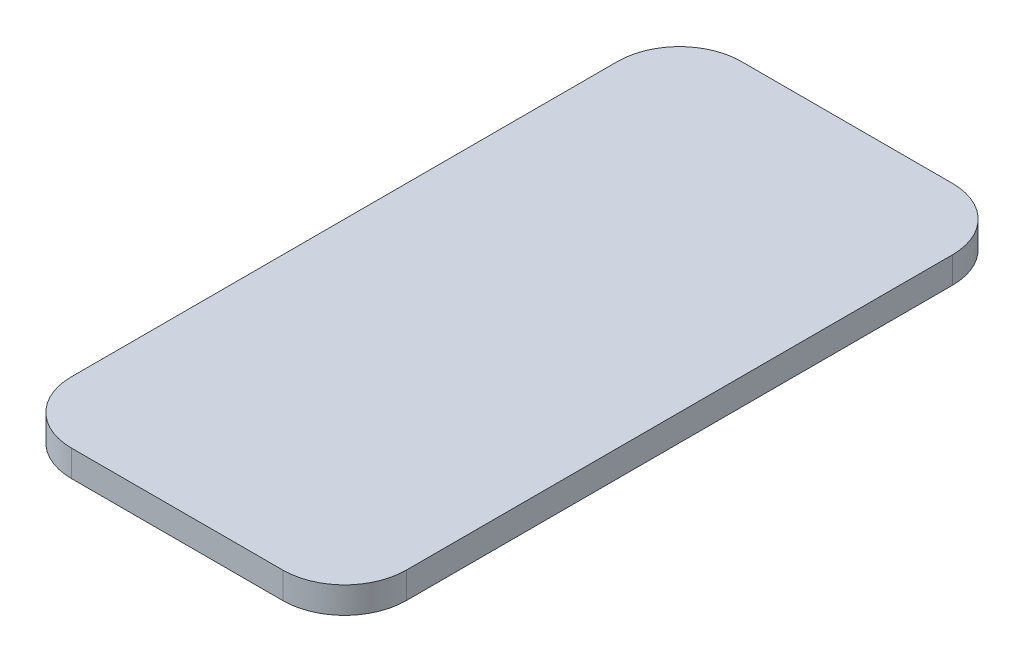
ISO-10303-21;
HEADER;
FILE_DESCRIPTION(('STEP AP214'),'2;1');
FILE_NAME('part.step','',(''),(''),'','','');
FILE_SCHEMA(('AUTOMOTIVE_DESIGN { 1 0 10303 214 1 1 1 1 }'));
ENDSEC;
DATA;
#1=APPLICATION_CONTEXT('core data for automotive mechanical design processes');
#2=APPLICATION_PROTOCOL_DEFINITION('international standard','automotive_design',2000,#1);
#3=PRODUCT_CONTEXT('',#1,'mechanical');
#4=PRODUCT('Part','Part','',(#3));
#5=PRODUCT_RELATED_PRODUCT_CATEGORY('part','',(#4));
#6=PRODUCT_DEFINITION_FORMATION('','',#4);
#7=PRODUCT_DEFINITION_CONTEXT('part definition',#1,'design');
#8=PRODUCT_DEFINITION('design','',#6,#7);
#9=PRODUCT_DEFINITION_SHAPE('','',#8);
#10=(LENGTH_UNIT() NAMED_UNIT(*) SI_UNIT(.MILLI.,.METRE.));
#11=(NAMED_UNIT(*) PLANE_ANGLE_UNIT() SI_UNIT($,.RADIAN.));
#12=(NAMED_UNIT(*) SI_UNIT($,.STERADIAN.) SOLID_ANGLE_UNIT());
#13=UNCERTAINTY_MEASURE_WITH_UNIT(LENGTH_MEASURE(1.E-05),#10,'distance_accuracy_value','');
#14=(GEOMETRIC_REPRESENTATION_CONTEXT(3) GLOBAL_UNCERTAINTY_ASSIGNED_CONTEXT((#13)) GLOBAL_UNIT_ASSIGNED_CONTEXT((#10,
#11,#12)) REPRESENTATION_CONTEXT('',''));
#15=CARTESIAN_POINT('',(0.,0.,0.));
#16=DIRECTION('',(0.,0.,1.));
#17=DIRECTION('',(1.,0.,0.));
#18=AXIS2_PLACEMENT_3D('',#15,#16,#17);
#19=CARTESIAN_POINT('',(-12.,3.,31.));
#20=DIRECTION('',(0.,-1.,0.));
#21=DIRECTION('',(0.,0.,-1.));
#22=AXIS2_PLACEMENT_3D('',#19,#20,#21);
#23=CYLINDRICAL_SURFACE('',#22,7.);
#24=CARTESIAN_POINT('',(-12.,0.,31.));
#25=DIRECTION('',(0.,1.,0.));
#26=DIRECTION('',(0.,0.,-1.));
#27=AXIS2_PLACEMENT_3D('',#24,#25,#26);
#28=CIRCLE('',#27,7.);
#29=CARTESIAN_POINT('',(-19.,0.,31.));
#30=VERTEX_POINT('',#29);
#31=CARTESIAN_POINT('',(-11.9999999999999,0.,38.));
#32=VERTEX_POINT('',#31);
#33=EDGE_CURVE('E141',#30,#32,#28,.T.);
#34=ORIENTED_EDGE('',*,*,#33,.T.);
#35=DIRECTION('',(0.,-1.,0.));
#36=VECTOR('',#35,1.);
#37=CARTESIAN_POINT('',(-11.9999999999999,3.,38.));
#38=LINE('',#37,#36);
#39=CARTESIAN_POINT('',(-11.9999999999999,3.,38.));
#40=VERTEX_POINT('',#39);
#41=EDGE_CURVE('E11',#40,#32,#38,.T.);
#42=ORIENTED_EDGE('',*,*,#41,.F.);
#43=CARTESIAN_POINT('',(-12.,3.,31.));
#44=DIRECTION('',(0.,1.,0.));
#45=DIRECTION('',(0.,0.,-1.));
#46=AXIS2_PLACEMENT_3D('',#43,#44,#45);
#47=CIRCLE('',#46,7.);
#48=CARTESIAN_POINT('',(-19.,3.,31.));
#49=VERTEX_POINT('',#48);
#50=EDGE_CURVE('E155',#49,#40,#47,.T.);
#51=ORIENTED_EDGE('',*,*,#50,.F.);
#52=DIRECTION('',(0.,-1.,0.));
#53=VECTOR('',#52,1.);
#54=CARTESIAN_POINT('',(-19.,3.,31.));
#55=LINE('',#54,#53);
#56=EDGE_CURVE('E137',#49,#30,#55,.T.);
#57=ORIENTED_EDGE('',*,*,#56,.T.);
#58=EDGE_LOOP('',(#34,#42,#51,#57));
#59=FACE_BOUND('',#58,.T.);
#60=ADVANCED_FACE('F45',(#59),#23,.T.);
#61=CARTESIAN_POINT('',(-11.9999999999999,3.,38.));
#62=DIRECTION('',(0.,0.,-1.));
#63=DIRECTION('',(-1.,0.,0.));
#64=AXIS2_PLACEMENT_3D('',#61,#62,#63);
#65=PLANE('',#64);
#66=DIRECTION('',(1.,0.,0.));
#67=VECTOR('',#66,1.);
#68=CARTESIAN_POINT('',(-11.9999999999999,0.,38.));
#69=LINE('',#68,#67);
#70=CARTESIAN_POINT('',(12.,0.,38.));
#71=VERTEX_POINT('',#70);
#72=EDGE_CURVE('E144',#32,#71,#69,.T.);
#73=ORIENTED_EDGE('',*,*,#72,.T.);
#74=DIRECTION('',(0.,-1.,0.));
#75=VECTOR('',#74,1.);
#76=CARTESIAN_POINT('',(12.,3.,38.));
#77=LINE('',#76,#75);
#78=CARTESIAN_POINT('',(12.,3.,38.));
#79=VERTEX_POINT('',#78);
#80=EDGE_CURVE('E53',#79,#71,#77,.T.);
#81=ORIENTED_EDGE('',*,*,#80,.F.);
#82=DIRECTION('',(1.,0.,0.));
#83=VECTOR('',#82,1.);
#84=CARTESIAN_POINT('',(-11.9999999999999,3.,38.));
#85=LINE('',#84,#83);
#86=EDGE_CURVE('E104',#40,#79,#85,.T.);
#87=ORIENTED_EDGE('',*,*,#86,.F.);
#88=ORIENTED_EDGE('',*,*,#41,.T.);
#89=EDGE_LOOP('',(#73,#81,#87,#88));
#90=FACE_BOUND('',#89,.T.);
#91=ADVANCED_FACE('F190',(#90),#65,.F.);
#92=CARTESIAN_POINT('',(12.,3.,31.));
#93=DIRECTION('',(0.,-1.,0.));
#94=DIRECTION('',(0.,0.,-1.));
#95=AXIS2_PLACEMENT_3D('',#92,#93,#94);
#96=CYLINDRICAL_SURFACE('',#95,7.);
#97=CARTESIAN_POINT('',(12.,0.,31.));
#98=DIRECTION('',(0.,1.,0.));
#99=DIRECTION('',(0.,0.,1.));
#100=AXIS2_PLACEMENT_3D('',#97,#98,#99);
#101=CIRCLE('',#100,7.);
#102=CARTESIAN_POINT('',(19.,0.,31.));
#103=VERTEX_POINT('',#102);
#104=EDGE_CURVE('E146',#71,#103,#101,.T.);
#105=ORIENTED_EDGE('',*,*,#104,.T.);
#106=DIRECTION('',(0.,-1.,0.));
#107=VECTOR('',#106,1.);
#108=CARTESIAN_POINT('',(19.,3.,31.));
#109=LINE('',#108,#107);
#110=CARTESIAN_POINT('',(19.,3.,31.));
#111=VERTEX_POINT('',#110);
#112=EDGE_CURVE('E162',#111,#103,#109,.T.);
#113=ORIENTED_EDGE('',*,*,#112,.F.);
#114=CARTESIAN_POINT('',(12.,3.,31.));
#115=DIRECTION('',(0.,1.,0.));
#116=DIRECTION('',(0.,0.,1.));
#117=AXIS2_PLACEMENT_3D('',#114,#115,#116);
#118=CIRCLE('',#117,7.);
#119=EDGE_CURVE('E170',#79,#111,#118,.T.);
#120=ORIENTED_EDGE('',*,*,#119,.F.);
#121=ORIENTED_EDGE('',*,*,#80,.T.);
#122=EDGE_LOOP('',(#105,#113,#120,#121));
#123=FACE_BOUND('',#122,.T.);
#124=ADVANCED_FACE('F168',(#123),#96,.T.);
#125=CARTESIAN_POINT('',(19.,3.,31.));
#126=DIRECTION('',(-1.,0.,0.));
#127=DIRECTION('',(0.,0.,1.));
#128=AXIS2_PLACEMENT_3D('',#125,#126,#127);
#129=PLANE('',#128);
#130=DIRECTION('',(0.,0.,-1.));
#131=VECTOR('',#130,1.);
#132=CARTESIAN_POINT('',(19.,0.,31.));
#133=LINE('',#132,#131);
#134=CARTESIAN_POINT('',(19.,0.,-31.));
#135=VERTEX_POINT('',#134);
#136=EDGE_CURVE('E148',#103,#135,#133,.T.);
#137=ORIENTED_EDGE('',*,*,#136,.T.);
#138=DIRECTION('',(0.,-1.,0.));
#139=VECTOR('',#138,1.);
#140=CARTESIAN_POINT('',(19.,3.,-31.));
#141=LINE('',#140,#139);
#142=CARTESIAN_POINT('',(19.,3.,-31.));
#143=VERTEX_POINT('',#142);
#144=EDGE_CURVE('E159',#143,#135,#141,.T.);
#145=ORIENTED_EDGE('',*,*,#144,.F.);
#146=DIRECTION('',(0.,0.,-1.));
#147=VECTOR('',#146,1.);
#148=CARTESIAN_POINT('',(19.,3.,31.));
#149=LINE('',#148,#147);
#150=EDGE_CURVE('E182',#111,#143,#149,.T.);
#151=ORIENTED_EDGE('',*,*,#150,.F.);
#152=ORIENTED_EDGE('',*,*,#112,.T.);
#153=EDGE_LOOP('',(#137,#145,#151,#152));
#154=FACE_BOUND('',#153,.T.);
#155=ADVANCED_FACE('F178',(#154),#129,.F.);
#156=CARTESIAN_POINT('',(12.,3.,-31.));
#157=DIRECTION('',(0.,-1.,0.));
#158=DIRECTION('',(0.,0.,-1.));
#159=AXIS2_PLACEMENT_3D('',#156,#157,#158);
#160=CYLINDRICAL_SURFACE('',#159,7.);
#161=CARTESIAN_POINT('',(12.,0.,-31.));
#162=DIRECTION('',(0.,1.,0.));
#163=DIRECTION('',(0.,0.,-1.));
#164=AXIS2_PLACEMENT_3D('',#161,#162,#163);
#165=CIRCLE('',#164,7.);
#166=CARTESIAN_POINT('',(12.,0.,-38.));
#167=VERTEX_POINT('',#166);
#168=EDGE_CURVE('E150',#135,#167,#165,.T.);
#169=ORIENTED_EDGE('',*,*,#168,.T.);
#170=DIRECTION('',(0.,-1.,0.));
#171=VECTOR('',#170,1.);
#172=CARTESIAN_POINT('',(12.,3.,-38.));
#173=LINE('',#172,#171);
#174=CARTESIAN_POINT('',(12.,3.,-38.));
#175=VERTEX_POINT('',#174);
#176=EDGE_CURVE('E132',#175,#167,#173,.T.);
#177=ORIENTED_EDGE('',*,*,#176,.F.);
#178=CARTESIAN_POINT('',(12.,3.,-31.));
#179=DIRECTION('',(0.,1.,0.));
#180=DIRECTION('',(0.,0.,-1.));
#181=AXIS2_PLACEMENT_3D('',#178,#179,#180);
#182=CIRCLE('',#181,7.);
#183=EDGE_CURVE('E123',#143,#175,#182,.T.);
#184=ORIENTED_EDGE('',*,*,#183,.F.);
#185=ORIENTED_EDGE('',*,*,#144,.T.);
#186=EDGE_LOOP('',(#169,#177,#184,#185));
#187=FACE_BOUND('',#186,.T.);
#188=ADVANCED_FACE('F181',(#187),#160,.T.);
#189=CARTESIAN_POINT('',(-11.9999999999999,3.,-38.));
#190=DIRECTION('',(0.,0.,1.));
#191=DIRECTION('',(1.,0.,0.));
#192=AXIS2_PLACEMENT_3D('',#189,#190,#191);
#193=PLANE('',#192);
#194=DIRECTION('',(-1.,0.,0.));
#195=VECTOR('',#194,1.);
#196=CARTESIAN_POINT('',(-11.9999999999999,0.,-38.));
#197=LINE('',#196,#195);
#198=CARTESIAN_POINT('',(-11.9999999999999,0.,-38.));
#199=VERTEX_POINT('',#198);
#200=EDGE_CURVE('E131',#167,#199,#197,.T.);
#201=ORIENTED_EDGE('',*,*,#200,.T.);
#202=DIRECTION('',(0.,-1.,0.));
#203=VECTOR('',#202,1.);
#204=CARTESIAN_POINT('',(-11.9999999999999,3.,-38.));
#205=LINE('',#204,#203);
#206=CARTESIAN_POINT('',(-11.9999999999999,3.,-38.));
#207=VERTEX_POINT('',#206);
#208=EDGE_CURVE('E128',#207,#199,#205,.T.);
#209=ORIENTED_EDGE('',*,*,#208,.F.);
#210=DIRECTION('',(-1.,0.,0.));
#211=VECTOR('',#210,1.);
#212=CARTESIAN_POINT('',(-11.9999999999999,3.,-38.));
#213=LINE('',#212,#211);
#214=EDGE_CURVE('E117',#175,#207,#213,.T.);
#215=ORIENTED_EDGE('',*,*,#214,.F.);
#216=ORIENTED_EDGE('',*,*,#176,.T.);
#217=EDGE_LOOP('',(#201,#209,#215,#216));
#218=FACE_BOUND('',#217,.T.);
#219=ADVANCED_FACE('F129',(#218),#193,.F.);
#220=CARTESIAN_POINT('',(-12.,3.,-31.));
#221=DIRECTION('',(0.,-1.,0.));
#222=DIRECTION('',(0.,0.,-1.));
#223=AXIS2_PLACEMENT_3D('',#220,#221,#222);
#224=CYLINDRICAL_SURFACE('',#223,7.);
#225=CARTESIAN_POINT('',(-12.,0.,-31.));
#226=DIRECTION('',(0.,1.,0.));
#227=DIRECTION('',(0.,0.,-1.));
#228=AXIS2_PLACEMENT_3D('',#225,#226,#227);
#229=CIRCLE('',#228,7.);
#230=CARTESIAN_POINT('',(-19.,0.,-30.9999999999999));
#231=VERTEX_POINT('',#230);
#232=EDGE_CURVE('E90',#199,#231,#229,.T.);
#233=ORIENTED_EDGE('',*,*,#232,.T.);
#234=DIRECTION('',(0.,-1.,0.));
#235=VECTOR('',#234,1.);
#236=CARTESIAN_POINT('',(-19.,3.,-30.9999999999999));
#237=LINE('',#236,#235);
#238=CARTESIAN_POINT('',(-19.,3.,-30.9999999999999));
#239=VERTEX_POINT('',#238);
#240=EDGE_CURVE('E133',#239,#231,#237,.T.);
#241=ORIENTED_EDGE('',*,*,#240,.F.);
#242=CARTESIAN_POINT('',(-12.,3.,-31.));
#243=DIRECTION('',(0.,1.,0.));
#244=DIRECTION('',(0.,0.,-1.));
#245=AXIS2_PLACEMENT_3D('',#242,#243,#244);
#246=CIRCLE('',#245,7.);
#247=EDGE_CURVE('E121',#207,#239,#246,.T.);
#248=ORIENTED_EDGE('',*,*,#247,.F.);
#249=ORIENTED_EDGE('',*,*,#208,.T.);
#250=EDGE_LOOP('',(#233,#241,#248,#249));
#251=FACE_BOUND('',#250,.T.);
#252=ADVANCED_FACE('F135',(#251),#224,.T.);
#253=CARTESIAN_POINT('',(-19.,3.,31.));
#254=DIRECTION('',(1.,0.,0.));
#255=DIRECTION('',(0.,0.,-1.));
#256=AXIS2_PLACEMENT_3D('',#253,#254,#255);
#257=PLANE('',#256);
#258=DIRECTION('',(0.,0.,1.));
#259=VECTOR('',#258,1.);
#260=CARTESIAN_POINT('',(-19.,0.,31.));
#261=LINE('',#260,#259);
#262=EDGE_CURVE('E96',#231,#30,#261,.T.);
#263=ORIENTED_EDGE('',*,*,#262,.T.);
#264=ORIENTED_EDGE('',*,*,#56,.F.);
#265=DIRECTION('',(0.,0.,1.));
#266=VECTOR('',#265,1.);
#267=CARTESIAN_POINT('',(-19.,3.,31.));
#268=LINE('',#267,#266);
#269=EDGE_CURVE('E61',#239,#49,#268,.T.);
#270=ORIENTED_EDGE('',*,*,#269,.F.);
#271=ORIENTED_EDGE('',*,*,#240,.T.);
#272=EDGE_LOOP('',(#263,#264,#270,#271));
#273=FACE_BOUND('',#272,.T.);
#274=ADVANCED_FACE('F206',(#273),#257,.F.);
#275=CARTESIAN_POINT('',(-12.,3.,31.));
#276=DIRECTION('',(0.,-1.,0.));
#277=DIRECTION('',(0.,0.,-1.));
#278=AXIS2_PLACEMENT_3D('',#275,#276,#277);
#279=PLANE('',#278);
#280=ORIENTED_EDGE('',*,*,#50,.T.);
#281=ORIENTED_EDGE('',*,*,#86,.T.);
#282=ORIENTED_EDGE('',*,*,#119,.T.);
#283=ORIENTED_EDGE('',*,*,#150,.T.);
#284=ORIENTED_EDGE('',*,*,#183,.T.);
#285=ORIENTED_EDGE('',*,*,#214,.T.);
#286=ORIENTED_EDGE('',*,*,#247,.T.);
#287=ORIENTED_EDGE('',*,*,#269,.T.);
#288=EDGE_LOOP('',(#280,#281,#282,#283,#284,#285,#286,#287));
#289=FACE_BOUND('',#288,.T.);
#290=ADVANCED_FACE('F119',(#289),#279,.F.);
#291=CARTESIAN_POINT('',(-12.,0.,31.));
#292=DIRECTION('',(0.,-1.,0.));
#293=DIRECTION('',(0.,0.,-1.));
#294=AXIS2_PLACEMENT_3D('',#291,#292,#293);
#295=PLANE('',#294);
#296=ORIENTED_EDGE('',*,*,#33,.F.);
#297=ORIENTED_EDGE('',*,*,#262,.F.);
#298=ORIENTED_EDGE('',*,*,#232,.F.);
#299=ORIENTED_EDGE('',*,*,#200,.F.);
#300=ORIENTED_EDGE('',*,*,#168,.F.);
#301=ORIENTED_EDGE('',*,*,#136,.F.);
#302=ORIENTED_EDGE('',*,*,#104,.F.);
#303=ORIENTED_EDGE('',*,*,#72,.F.);
#304=EDGE_LOOP('',(#296,#297,#298,#299,#300,#301,#302,#303));
#305=FACE_BOUND('',#304,.T.);
#306=ADVANCED_FACE('F174',(#305),#295,.T.);
#307=CLOSED_SHELL('',(#60,#91,#124,#155,#188,#219,#252,#274,#290,#306));
#308=MANIFOLD_SOLID_BREP('B2',#307);
#309=ADVANCED_BREP_SHAPE_REPRESENTATION('',(#18,#308),#14);
#310=SHAPE_DEFINITION_REPRESENTATION(#9,#309);
ENDSEC;
END-ISO-10303-21;
